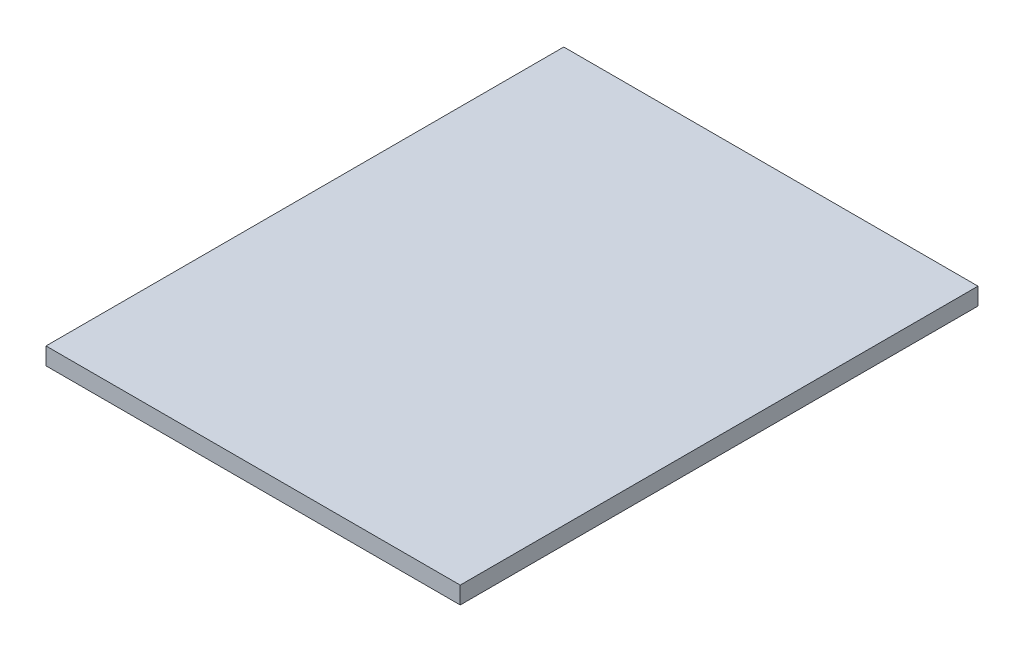
ISO-10303-21;
HEADER;
FILE_DESCRIPTION(('STEP AP214'),'2;1');
FILE_NAME('part.step','',(''),(''),'','','');
FILE_SCHEMA(('AUTOMOTIVE_DESIGN { 1 0 10303 214 1 1 1 1 }'));
ENDSEC;
DATA;
#1=APPLICATION_CONTEXT('core data for automotive mechanical design processes');
#2=APPLICATION_PROTOCOL_DEFINITION('international standard','automotive_design',2000,#1);
#3=PRODUCT_CONTEXT('',#1,'mechanical');
#4=PRODUCT('Part','Part','',(#3));
#5=PRODUCT_RELATED_PRODUCT_CATEGORY('part','',(#4));
#6=PRODUCT_DEFINITION_FORMATION('','',#4);
#7=PRODUCT_DEFINITION_CONTEXT('part definition',#1,'design');
#8=PRODUCT_DEFINITION('design','',#6,#7);
#9=PRODUCT_DEFINITION_SHAPE('','',#8);
#10=(LENGTH_UNIT() NAMED_UNIT(*) SI_UNIT(.MILLI.,.METRE.));
#11=(NAMED_UNIT(*) PLANE_ANGLE_UNIT() SI_UNIT($,.RADIAN.));
#12=(NAMED_UNIT(*) SI_UNIT($,.STERADIAN.) SOLID_ANGLE_UNIT());
#13=UNCERTAINTY_MEASURE_WITH_UNIT(LENGTH_MEASURE(1.E-05),#10,'distance_accuracy_value','');
#14=(GEOMETRIC_REPRESENTATION_CONTEXT(3) GLOBAL_UNCERTAINTY_ASSIGNED_CONTEXT((#13)) GLOBAL_UNIT_ASSIGNED_CONTEXT((#10,
#11,#12)) REPRESENTATION_CONTEXT('',''));
#15=CARTESIAN_POINT('',(0.,0.,0.));
#16=DIRECTION('',(0.,0.,1.));
#17=DIRECTION('',(1.,0.,0.));
#18=AXIS2_PLACEMENT_3D('',#15,#16,#17);
#19=CARTESIAN_POINT('',(60.,5.,-75.));
#20=DIRECTION('',(-1.,0.,0.));
#21=DIRECTION('',(0.,0.,1.));
#22=AXIS2_PLACEMENT_3D('',#19,#20,#21);
#23=PLANE('',#22);
#24=DIRECTION('',(0.,0.,-1.));
#25=VECTOR('',#24,1.);
#26=CARTESIAN_POINT('',(60.,0.,-75.));
#27=LINE('',#26,#25);
#28=CARTESIAN_POINT('',(60.,0.,75.));
#29=VERTEX_POINT('',#28);
#30=CARTESIAN_POINT('',(60.,0.,-75.));
#31=VERTEX_POINT('',#30);
#32=EDGE_CURVE('E97',#29,#31,#27,.T.);
#33=ORIENTED_EDGE('',*,*,#32,.T.);
#34=DIRECTION('',(0.,-1.,0.));
#35=VECTOR('',#34,1.);
#36=CARTESIAN_POINT('',(60.,5.,-75.));
#37=LINE('',#36,#35);
#38=CARTESIAN_POINT('',(60.,5.,-75.));
#39=VERTEX_POINT('',#38);
#40=EDGE_CURVE('E11',#39,#31,#37,.T.);
#41=ORIENTED_EDGE('',*,*,#40,.F.);
#42=DIRECTION('',(0.,0.,-1.));
#43=VECTOR('',#42,1.);
#44=CARTESIAN_POINT('',(60.,5.,-75.));
#45=LINE('',#44,#43);
#46=CARTESIAN_POINT('',(60.,5.,75.));
#47=VERTEX_POINT('',#46);
#48=EDGE_CURVE('E85',#47,#39,#45,.T.);
#49=ORIENTED_EDGE('',*,*,#48,.F.);
#50=DIRECTION('',(0.,-1.,0.));
#51=VECTOR('',#50,1.);
#52=CARTESIAN_POINT('',(60.,5.,75.));
#53=LINE('',#52,#51);
#54=EDGE_CURVE('E93',#47,#29,#53,.T.);
#55=ORIENTED_EDGE('',*,*,#54,.T.);
#56=EDGE_LOOP('',(#33,#41,#49,#55));
#57=FACE_BOUND('',#56,.T.);
#58=ADVANCED_FACE('F34',(#57),#23,.F.);
#59=CARTESIAN_POINT('',(-60.,5.,-75.));
#60=DIRECTION('',(0.,0.,1.));
#61=DIRECTION('',(1.,0.,0.));
#62=AXIS2_PLACEMENT_3D('',#59,#60,#61);
#63=PLANE('',#62);
#64=DIRECTION('',(-1.,0.,0.));
#65=VECTOR('',#64,1.);
#66=CARTESIAN_POINT('',(-60.,0.,-75.));
#67=LINE('',#66,#65);
#68=CARTESIAN_POINT('',(-60.,0.,-75.));
#69=VERTEX_POINT('',#68);
#70=EDGE_CURVE('E89',#31,#69,#67,.T.);
#71=ORIENTED_EDGE('',*,*,#70,.T.);
#72=DIRECTION('',(0.,-1.,0.));
#73=VECTOR('',#72,1.);
#74=CARTESIAN_POINT('',(-60.,5.,-75.));
#75=LINE('',#74,#73);
#76=CARTESIAN_POINT('',(-60.,5.,-75.));
#77=VERTEX_POINT('',#76);
#78=EDGE_CURVE('E42',#77,#69,#75,.T.);
#79=ORIENTED_EDGE('',*,*,#78,.F.);
#80=DIRECTION('',(-1.,0.,0.));
#81=VECTOR('',#80,1.);
#82=CARTESIAN_POINT('',(-60.,5.,-75.));
#83=LINE('',#82,#81);
#84=EDGE_CURVE('E80',#39,#77,#83,.T.);
#85=ORIENTED_EDGE('',*,*,#84,.F.);
#86=ORIENTED_EDGE('',*,*,#40,.T.);
#87=EDGE_LOOP('',(#71,#79,#85,#86));
#88=FACE_BOUND('',#87,.T.);
#89=ADVANCED_FACE('F88',(#88),#63,.F.);
#90=CARTESIAN_POINT('',(-60.,5.,-75.));
#91=DIRECTION('',(1.,0.,0.));
#92=DIRECTION('',(0.,0.,-1.));
#93=AXIS2_PLACEMENT_3D('',#90,#91,#92);
#94=PLANE('',#93);
#95=DIRECTION('',(0.,0.,1.));
#96=VECTOR('',#95,1.);
#97=CARTESIAN_POINT('',(-60.,0.,-75.));
#98=LINE('',#97,#96);
#99=CARTESIAN_POINT('',(-60.,0.,75.));
#100=VERTEX_POINT('',#99);
#101=EDGE_CURVE('E67',#69,#100,#98,.T.);
#102=ORIENTED_EDGE('',*,*,#101,.T.);
#103=DIRECTION('',(0.,-1.,0.));
#104=VECTOR('',#103,1.);
#105=CARTESIAN_POINT('',(-60.,5.,75.));
#106=LINE('',#105,#104);
#107=CARTESIAN_POINT('',(-60.,5.,75.));
#108=VERTEX_POINT('',#107);
#109=EDGE_CURVE('E90',#108,#100,#106,.T.);
#110=ORIENTED_EDGE('',*,*,#109,.F.);
#111=DIRECTION('',(0.,0.,1.));
#112=VECTOR('',#111,1.);
#113=CARTESIAN_POINT('',(-60.,5.,-75.));
#114=LINE('',#113,#112);
#115=EDGE_CURVE('E83',#77,#108,#114,.T.);
#116=ORIENTED_EDGE('',*,*,#115,.F.);
#117=ORIENTED_EDGE('',*,*,#78,.T.);
#118=EDGE_LOOP('',(#102,#110,#116,#117));
#119=FACE_BOUND('',#118,.T.);
#120=ADVANCED_FACE('F91',(#119),#94,.F.);
#121=CARTESIAN_POINT('',(-60.,5.,75.));
#122=DIRECTION('',(0.,0.,-1.));
#123=DIRECTION('',(-1.,0.,0.));
#124=AXIS2_PLACEMENT_3D('',#121,#122,#123);
#125=PLANE('',#124);
#126=DIRECTION('',(1.,0.,0.));
#127=VECTOR('',#126,1.);
#128=CARTESIAN_POINT('',(-60.,0.,75.));
#129=LINE('',#128,#127);
#130=EDGE_CURVE('E73',#100,#29,#129,.T.);
#131=ORIENTED_EDGE('',*,*,#130,.T.);
#132=ORIENTED_EDGE('',*,*,#54,.F.);
#133=DIRECTION('',(1.,0.,0.));
#134=VECTOR('',#133,1.);
#135=CARTESIAN_POINT('',(-60.,5.,75.));
#136=LINE('',#135,#134);
#137=EDGE_CURVE('E50',#108,#47,#136,.T.);
#138=ORIENTED_EDGE('',*,*,#137,.F.);
#139=ORIENTED_EDGE('',*,*,#109,.T.);
#140=EDGE_LOOP('',(#131,#132,#138,#139));
#141=FACE_BOUND('',#140,.T.);
#142=ADVANCED_FACE('F104',(#141),#125,.F.);
#143=CARTESIAN_POINT('',(0.,5.,0.));
#144=DIRECTION('',(0.,1.,0.));
#145=DIRECTION('',(0.,0.,1.));
#146=AXIS2_PLACEMENT_3D('',#143,#144,#145);
#147=PLANE('',#146);
#148=ORIENTED_EDGE('',*,*,#48,.T.);
#149=ORIENTED_EDGE('',*,*,#84,.T.);
#150=ORIENTED_EDGE('',*,*,#115,.T.);
#151=ORIENTED_EDGE('',*,*,#137,.T.);
#152=EDGE_LOOP('',(#148,#149,#150,#151));
#153=FACE_BOUND('',#152,.T.);
#154=ADVANCED_FACE('F81',(#153),#147,.T.);
#155=CARTESIAN_POINT('',(0.,0.,0.));
#156=DIRECTION('',(0.,1.,0.));
#157=DIRECTION('',(0.,0.,1.));
#158=AXIS2_PLACEMENT_3D('',#155,#156,#157);
#159=PLANE('',#158);
#160=ORIENTED_EDGE('',*,*,#32,.F.);
#161=ORIENTED_EDGE('',*,*,#130,.F.);
#162=ORIENTED_EDGE('',*,*,#101,.F.);
#163=ORIENTED_EDGE('',*,*,#70,.F.);
#164=EDGE_LOOP('',(#160,#161,#162,#163));
#165=FACE_BOUND('',#164,.T.);
#166=ADVANCED_FACE('F107',(#165),#159,.F.);
#167=CLOSED_SHELL('',(#58,#89,#120,#142,#154,#166));
#168=MANIFOLD_SOLID_BREP('B2',#167);
#169=ADVANCED_BREP_SHAPE_REPRESENTATION('',(#18,#168),#14);
#170=SHAPE_DEFINITION_REPRESENTATION(#9,#169);
ENDSEC;
END-ISO-10303-21;
